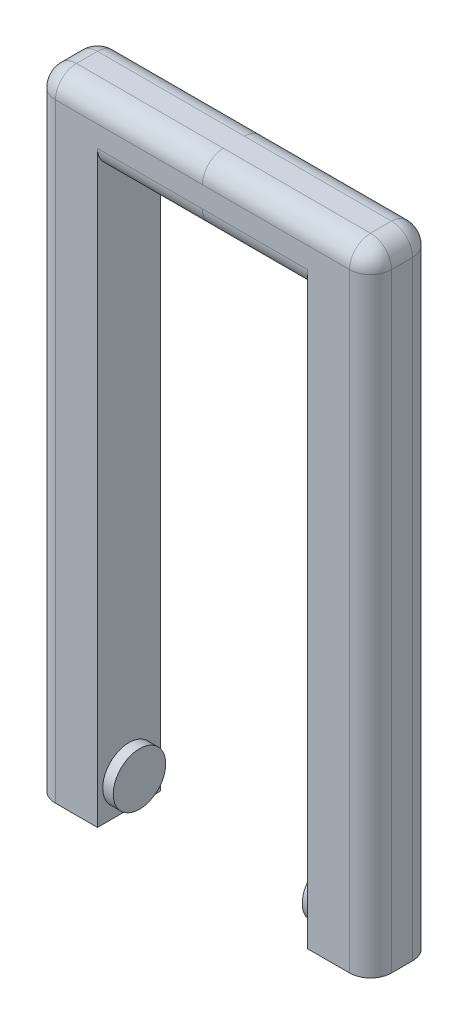
ISO-10303-21;
HEADER;
FILE_DESCRIPTION(('STEP AP214'),'2;1');
FILE_NAME('part.step','',(''),(''),'','','');
FILE_SCHEMA(('AUTOMOTIVE_DESIGN { 1 0 10303 214 1 1 1 1 }'));
ENDSEC;
DATA;
#1=APPLICATION_CONTEXT('core data for automotive mechanical design processes');
#2=APPLICATION_PROTOCOL_DEFINITION('international standard','automotive_design',2000,#1);
#3=PRODUCT_CONTEXT('',#1,'mechanical');
#4=PRODUCT('Part','Part','',(#3));
#5=PRODUCT_RELATED_PRODUCT_CATEGORY('part','',(#4));
#6=PRODUCT_DEFINITION_FORMATION('','',#4);
#7=PRODUCT_DEFINITION_CONTEXT('part definition',#1,'design');
#8=PRODUCT_DEFINITION('design','',#6,#7);
#9=PRODUCT_DEFINITION_SHAPE('','',#8);
#10=(LENGTH_UNIT() NAMED_UNIT(*) SI_UNIT(.MILLI.,.METRE.));
#11=(NAMED_UNIT(*) PLANE_ANGLE_UNIT() SI_UNIT($,.RADIAN.));
#12=(NAMED_UNIT(*) SI_UNIT($,.STERADIAN.) SOLID_ANGLE_UNIT());
#13=UNCERTAINTY_MEASURE_WITH_UNIT(LENGTH_MEASURE(1.E-05),#10,'distance_accuracy_value','');
#14=(GEOMETRIC_REPRESENTATION_CONTEXT(3) GLOBAL_UNCERTAINTY_ASSIGNED_CONTEXT((#13)) GLOBAL_UNIT_ASSIGNED_CONTEXT((#10,
#11,#12)) REPRESENTATION_CONTEXT('',''));
#15=CARTESIAN_POINT('',(0.,0.,0.));
#16=DIRECTION('',(0.,0.,1.));
#17=DIRECTION('',(1.,0.,0.));
#18=AXIS2_PLACEMENT_3D('',#15,#16,#17);
#19=CARTESIAN_POINT('',(0.,30.,3.));
#20=DIRECTION('',(0.,-1.,0.));
#21=DIRECTION('',(0.,0.,-1.));
#22=AXIS2_PLACEMENT_3D('',#19,#20,#21);
#23=PLANE('',#22);
#24=DIRECTION('',(-1.,0.,0.));
#25=VECTOR('',#24,1.);
#26=CARTESIAN_POINT('',(0.,30.,2.));
#27=LINE('',#26,#25);
#28=CARTESIAN_POINT('',(-6.99999999999999,30.,2.));
#29=VERTEX_POINT('',#28);
#30=CARTESIAN_POINT('',(0.,30.,2.));
#31=VERTEX_POINT('',#30);
#32=EDGE_CURVE('E264',#29,#31,#27,.F.);
#33=ORIENTED_EDGE('',*,*,#32,.T.);
#34=DIRECTION('',(1.,0.,0.));
#35=VECTOR('',#34,1.);
#36=CARTESIAN_POINT('',(6.99999999999999,30.,2.));
#37=LINE('',#36,#35);
#38=CARTESIAN_POINT('',(6.99999999999999,30.,2.));
#39=VERTEX_POINT('',#38);
#40=EDGE_CURVE('E327',#31,#39,#37,.T.);
#41=ORIENTED_EDGE('',*,*,#40,.T.);
#42=DIRECTION('',(0.,0.,-1.));
#43=VECTOR('',#42,1.);
#44=CARTESIAN_POINT('',(6.99999999999999,30.,1.));
#45=LINE('',#44,#43);
#46=CARTESIAN_POINT('',(6.99999999999999,30.,1.));
#47=VERTEX_POINT('',#46);
#48=EDGE_CURVE('E325',#39,#47,#45,.T.);
#49=ORIENTED_EDGE('',*,*,#48,.T.);
#50=DIRECTION('',(1.,0.,0.));
#51=VECTOR('',#50,1.);
#52=CARTESIAN_POINT('',(0.,30.,1.));
#53=LINE('',#52,#51);
#54=CARTESIAN_POINT('',(0.,30.,1.));
#55=VERTEX_POINT('',#54);
#56=EDGE_CURVE('E323',#47,#55,#53,.F.);
#57=ORIENTED_EDGE('',*,*,#56,.T.);
#58=DIRECTION('',(-1.,0.,0.));
#59=VECTOR('',#58,1.);
#60=CARTESIAN_POINT('',(0.,30.,1.));
#61=LINE('',#60,#59);
#62=CARTESIAN_POINT('',(-6.99999999999999,30.,1.));
#63=VERTEX_POINT('',#62);
#64=EDGE_CURVE('E260',#55,#63,#61,.T.);
#65=ORIENTED_EDGE('',*,*,#64,.T.);
#66=DIRECTION('',(0.,0.,-1.));
#67=VECTOR('',#66,1.);
#68=CARTESIAN_POINT('',(-6.99999999999999,30.,3.));
#69=LINE('',#68,#67);
#70=EDGE_CURVE('E262',#63,#29,#69,.F.);
#71=ORIENTED_EDGE('',*,*,#70,.T.);
#72=EDGE_LOOP('',(#33,#41,#49,#57,#65,#71));
#73=FACE_BOUND('',#72,.T.);
#74=ADVANCED_FACE('F42',(#73),#23,.F.);
#75=CARTESIAN_POINT('',(-7.99999999999999,18.,3.));
#76=DIRECTION('',(1.,0.,0.));
#77=DIRECTION('',(0.,1.,0.));
#78=AXIS2_PLACEMENT_3D('',#75,#76,#77);
#79=PLANE('',#78);
#80=DIRECTION('',(0.,-1.,0.));
#81=VECTOR('',#80,1.);
#82=CARTESIAN_POINT('',(-7.99999999999999,30.,2.));
#83=LINE('',#82,#81);
#84=CARTESIAN_POINT('',(-8.,0.,2.));
#85=VERTEX_POINT('',#84);
#86=CARTESIAN_POINT('',(-7.99999999999999,29.,2.));
#87=VERTEX_POINT('',#86);
#88=EDGE_CURVE('E241',#85,#87,#83,.F.);
#89=ORIENTED_EDGE('',*,*,#88,.T.);
#90=DIRECTION('',(0.,0.,-1.));
#91=VECTOR('',#90,1.);
#92=CARTESIAN_POINT('',(-7.99999999999999,29.,3.));
#93=LINE('',#92,#91);
#94=CARTESIAN_POINT('',(-7.99999999999999,29.,1.));
#95=VERTEX_POINT('',#94);
#96=EDGE_CURVE('E258',#87,#95,#93,.T.);
#97=ORIENTED_EDGE('',*,*,#96,.T.);
#98=DIRECTION('',(0.,-1.,0.));
#99=VECTOR('',#98,1.);
#100=CARTESIAN_POINT('',(-7.99999999999999,18.,1.));
#101=LINE('',#100,#99);
#102=CARTESIAN_POINT('',(-8.,0.,1.));
#103=VERTEX_POINT('',#102);
#104=EDGE_CURVE('E244',#95,#103,#101,.T.);
#105=ORIENTED_EDGE('',*,*,#104,.T.);
#106=DIRECTION('',(0.,0.,-1.));
#107=VECTOR('',#106,1.);
#108=CARTESIAN_POINT('',(-8.,0.,3.));
#109=LINE('',#108,#107);
#110=EDGE_CURVE('E235',#85,#103,#109,.T.);
#111=ORIENTED_EDGE('',*,*,#110,.F.);
#112=EDGE_LOOP('',(#89,#97,#105,#111));
#113=FACE_BOUND('',#112,.T.);
#114=ADVANCED_FACE('F380',(#113),#79,.F.);
#115=CARTESIAN_POINT('',(-8.,0.,3.));
#116=DIRECTION('',(0.,1.,0.));
#117=DIRECTION('',(0.,0.,1.));
#118=AXIS2_PLACEMENT_3D('',#115,#116,#117);
#119=PLANE('',#118);
#120=ORIENTED_EDGE('',*,*,#110,.T.);
#121=CARTESIAN_POINT('',(-7.,0.,1.));
#122=DIRECTION('',(0.,1.,0.));
#123=DIRECTION('',(0.,0.,1.));
#124=AXIS2_PLACEMENT_3D('',#121,#122,#123);
#125=CIRCLE('',#124,1.);
#126=CARTESIAN_POINT('',(-7.,0.,0.));
#127=VERTEX_POINT('',#126);
#128=EDGE_CURVE('E248',#103,#127,#125,.F.);
#129=ORIENTED_EDGE('',*,*,#128,.T.);
#130=DIRECTION('',(1.,0.,0.));
#131=VECTOR('',#130,1.);
#132=CARTESIAN_POINT('',(-8.,0.,0.));
#133=LINE('',#132,#131);
#134=CARTESIAN_POINT('',(-5.,0.,0.));
#135=VERTEX_POINT('',#134);
#136=EDGE_CURVE('E220',#127,#135,#133,.T.);
#137=ORIENTED_EDGE('',*,*,#136,.T.);
#138=DIRECTION('',(0.,0.,-1.));
#139=VECTOR('',#138,1.);
#140=CARTESIAN_POINT('',(-5.,0.,3.));
#141=LINE('',#140,#139);
#142=CARTESIAN_POINT('',(-5.,0.,3.));
#143=VERTEX_POINT('',#142);
#144=EDGE_CURVE('E232',#143,#135,#141,.T.);
#145=ORIENTED_EDGE('',*,*,#144,.F.);
#146=DIRECTION('',(1.,0.,0.));
#147=VECTOR('',#146,1.);
#148=CARTESIAN_POINT('',(-8.,0.,3.));
#149=LINE('',#148,#147);
#150=CARTESIAN_POINT('',(-7.,0.,3.));
#151=VERTEX_POINT('',#150);
#152=EDGE_CURVE('E222',#151,#143,#149,.T.);
#153=ORIENTED_EDGE('',*,*,#152,.F.);
#154=CARTESIAN_POINT('',(-7.,0.,2.));
#155=DIRECTION('',(0.,1.,0.));
#156=DIRECTION('',(0.,0.,1.));
#157=AXIS2_PLACEMENT_3D('',#154,#155,#156);
#158=CIRCLE('',#157,1.);
#159=EDGE_CURVE('E246',#151,#85,#158,.F.);
#160=ORIENTED_EDGE('',*,*,#159,.T.);
#161=EDGE_LOOP('',(#120,#129,#137,#145,#153,#160));
#162=FACE_BOUND('',#161,.T.);
#163=ADVANCED_FACE('F386',(#162),#119,.F.);
#164=CARTESIAN_POINT('',(-5.,0.,3.));
#165=DIRECTION('',(-1.,0.,0.));
#166=DIRECTION('',(0.,-1.,0.));
#167=AXIS2_PLACEMENT_3D('',#164,#165,#166);
#168=PLANE('',#167);
#169=CARTESIAN_POINT('',(-5.,1.5,1.5));
#170=DIRECTION('',(-1.,0.,0.));
#171=DIRECTION('',(0.,-1.,0.));
#172=AXIS2_PLACEMENT_3D('',#169,#170,#171);
#173=CIRCLE('',#172,1.25);
#174=CARTESIAN_POINT('',(-5.,0.25,1.5));
#175=VERTEX_POINT('',#174);
#176=EDGE_CURVE('E238',#175,#175,#173,.F.);
#177=ORIENTED_EDGE('',*,*,#176,.F.);
#178=EDGE_LOOP('',(#177));
#179=FACE_BOUND('',#178,.T.);
#180=DIRECTION('',(0.,1.,0.));
#181=VECTOR('',#180,1.);
#182=CARTESIAN_POINT('',(-5.,0.,0.));
#183=LINE('',#182,#181);
#184=CARTESIAN_POINT('',(-5.,28.,0.));
#185=VERTEX_POINT('',#184);
#186=EDGE_CURVE('E225',#135,#185,#183,.T.);
#187=ORIENTED_EDGE('',*,*,#186,.T.);
#188=CARTESIAN_POINT('',(-5.,28.,1.));
#189=DIRECTION('',(-1.,0.,0.));
#190=DIRECTION('',(0.,-1.,0.));
#191=AXIS2_PLACEMENT_3D('',#188,#189,#190);
#192=CIRCLE('',#191,1.);
#193=CARTESIAN_POINT('',(-5.,27.,1.));
#194=VERTEX_POINT('',#193);
#195=EDGE_CURVE('E291',#185,#194,#192,.T.);
#196=ORIENTED_EDGE('',*,*,#195,.T.);
#197=DIRECTION('',(0.,0.,-1.));
#198=VECTOR('',#197,1.);
#199=CARTESIAN_POINT('',(-5.,27.,3.));
#200=LINE('',#199,#198);
#201=CARTESIAN_POINT('',(-5.,27.,2.));
#202=VERTEX_POINT('',#201);
#203=EDGE_CURVE('E227',#202,#194,#200,.T.);
#204=ORIENTED_EDGE('',*,*,#203,.F.);
#205=CARTESIAN_POINT('',(-5.,28.,2.));
#206=DIRECTION('',(-1.,0.,0.));
#207=DIRECTION('',(0.,-1.,0.));
#208=AXIS2_PLACEMENT_3D('',#205,#206,#207);
#209=CIRCLE('',#208,1.);
#210=CARTESIAN_POINT('',(-5.,28.,3.));
#211=VERTEX_POINT('',#210);
#212=EDGE_CURVE('E293',#202,#211,#209,.T.);
#213=ORIENTED_EDGE('',*,*,#212,.T.);
#214=DIRECTION('',(0.,1.,0.));
#215=VECTOR('',#214,1.);
#216=CARTESIAN_POINT('',(-5.,0.,3.));
#217=LINE('',#216,#215);
#218=EDGE_CURVE('E224',#143,#211,#217,.T.);
#219=ORIENTED_EDGE('',*,*,#218,.F.);
#220=ORIENTED_EDGE('',*,*,#144,.T.);
#221=EDGE_LOOP('',(#187,#196,#204,#213,#219,#220));
#222=FACE_BOUND('',#221,.T.);
#223=ADVANCED_FACE('F467',(#179,#222),#168,.F.);
#224=CARTESIAN_POINT('',(-5.,27.,3.));
#225=DIRECTION('',(0.,1.,0.));
#226=DIRECTION('',(0.,0.,1.));
#227=AXIS2_PLACEMENT_3D('',#224,#225,#226);
#228=PLANE('',#227);
#229=DIRECTION('',(1.,0.,0.));
#230=VECTOR('',#229,1.);
#231=CARTESIAN_POINT('',(-5.,27.,1.));
#232=LINE('',#231,#230);
#233=CARTESIAN_POINT('',(0.,27.,1.));
#234=VERTEX_POINT('',#233);
#235=EDGE_CURVE('E270',#194,#234,#232,.T.);
#236=ORIENTED_EDGE('',*,*,#235,.T.);
#237=DIRECTION('',(-1.,0.,0.));
#238=VECTOR('',#237,1.);
#239=CARTESIAN_POINT('',(-5.,27.,1.));
#240=LINE('',#239,#238);
#241=CARTESIAN_POINT('',(5.,27.,1.));
#242=VERTEX_POINT('',#241);
#243=EDGE_CURVE('E66',#234,#242,#240,.F.);
#244=ORIENTED_EDGE('',*,*,#243,.T.);
#245=DIRECTION('',(0.,0.,-1.));
#246=VECTOR('',#245,1.);
#247=CARTESIAN_POINT('',(5.,27.,3.));
#248=LINE('',#247,#246);
#249=CARTESIAN_POINT('',(5.,27.,2.));
#250=VERTEX_POINT('',#249);
#251=EDGE_CURVE('E199',#250,#242,#248,.T.);
#252=ORIENTED_EDGE('',*,*,#251,.F.);
#253=DIRECTION('',(-1.,0.,0.));
#254=VECTOR('',#253,1.);
#255=CARTESIAN_POINT('',(0.,27.,2.));
#256=LINE('',#255,#254);
#257=CARTESIAN_POINT('',(0.,27.,2.));
#258=VERTEX_POINT('',#257);
#259=EDGE_CURVE('E338',#250,#258,#256,.T.);
#260=ORIENTED_EDGE('',*,*,#259,.T.);
#261=DIRECTION('',(1.,0.,0.));
#262=VECTOR('',#261,1.);
#263=CARTESIAN_POINT('',(-5.,27.,2.));
#264=LINE('',#263,#262);
#265=EDGE_CURVE('E268',#258,#202,#264,.F.);
#266=ORIENTED_EDGE('',*,*,#265,.T.);
#267=ORIENTED_EDGE('',*,*,#203,.T.);
#268=EDGE_LOOP('',(#236,#244,#252,#260,#266,#267));
#269=FACE_BOUND('',#268,.T.);
#270=ADVANCED_FACE('F458',(#269),#228,.F.);
#271=CARTESIAN_POINT('',(0.,0.,3.));
#272=DIRECTION('',(0.,0.,1.));
#273=DIRECTION('',(1.,0.,0.));
#274=AXIS2_PLACEMENT_3D('',#271,#272,#273);
#275=PLANE('',#274);
#276=DIRECTION('',(1.,0.,0.));
#277=VECTOR('',#276,1.);
#278=CARTESIAN_POINT('',(0.,28.,3.));
#279=LINE('',#278,#277);
#280=CARTESIAN_POINT('',(0.,28.,3.));
#281=VERTEX_POINT('',#280);
#282=EDGE_CURVE('E289',#211,#281,#279,.T.);
#283=ORIENTED_EDGE('',*,*,#282,.T.);
#284=DIRECTION('',(-1.,0.,0.));
#285=VECTOR('',#284,1.);
#286=CARTESIAN_POINT('',(5.,28.,3.));
#287=LINE('',#286,#285);
#288=CARTESIAN_POINT('',(5.,28.,3.));
#289=VERTEX_POINT('',#288);
#290=EDGE_CURVE('E204',#281,#289,#287,.F.);
#291=ORIENTED_EDGE('',*,*,#290,.T.);
#292=DIRECTION('',(0.,1.,0.));
#293=VECTOR('',#292,1.);
#294=CARTESIAN_POINT('',(5.,0.,3.));
#295=LINE('',#294,#293);
#296=CARTESIAN_POINT('',(5.,0.,3.));
#297=VERTEX_POINT('',#296);
#298=EDGE_CURVE('E58',#297,#289,#295,.T.);
#299=ORIENTED_EDGE('',*,*,#298,.F.);
#300=DIRECTION('',(-1.,0.,0.));
#301=VECTOR('',#300,1.);
#302=CARTESIAN_POINT('',(8.,0.,3.));
#303=LINE('',#302,#301);
#304=CARTESIAN_POINT('',(7.,0.,3.));
#305=VERTEX_POINT('',#304);
#306=EDGE_CURVE('E183',#305,#297,#303,.T.);
#307=ORIENTED_EDGE('',*,*,#306,.F.);
#308=DIRECTION('',(0.,-1.,0.));
#309=VECTOR('',#308,1.);
#310=CARTESIAN_POINT('',(7.,0.,3.));
#311=LINE('',#310,#309);
#312=CARTESIAN_POINT('',(6.99999999999999,29.,3.));
#313=VERTEX_POINT('',#312);
#314=EDGE_CURVE('E318',#305,#313,#311,.F.);
#315=ORIENTED_EDGE('',*,*,#314,.T.);
#316=DIRECTION('',(1.,0.,0.));
#317=VECTOR('',#316,1.);
#318=CARTESIAN_POINT('',(0.,29.,3.));
#319=LINE('',#318,#317);
#320=CARTESIAN_POINT('',(0.,29.,3.));
#321=VERTEX_POINT('',#320);
#322=EDGE_CURVE('E342',#313,#321,#319,.F.);
#323=ORIENTED_EDGE('',*,*,#322,.T.);
#324=DIRECTION('',(-1.,0.,0.));
#325=VECTOR('',#324,1.);
#326=CARTESIAN_POINT('',(-6.99999999999999,29.,3.));
#327=LINE('',#326,#325);
#328=CARTESIAN_POINT('',(-6.99999999999999,29.,3.));
#329=VERTEX_POINT('',#328);
#330=EDGE_CURVE('E287',#321,#329,#327,.T.);
#331=ORIENTED_EDGE('',*,*,#330,.T.);
#332=DIRECTION('',(0.,-1.,0.));
#333=VECTOR('',#332,1.);
#334=CARTESIAN_POINT('',(-7.,0.,3.));
#335=LINE('',#334,#333);
#336=EDGE_CURVE('E253',#329,#151,#335,.T.);
#337=ORIENTED_EDGE('',*,*,#336,.T.);
#338=ORIENTED_EDGE('',*,*,#152,.T.);
#339=ORIENTED_EDGE('',*,*,#218,.T.);
#340=EDGE_LOOP('',(#283,#291,#299,#307,#315,#323,#331,#337,#338,#339));
#341=FACE_BOUND('',#340,.T.);
#342=ADVANCED_FACE('F202',(#341),#275,.T.);
#343=CARTESIAN_POINT('',(0.,0.,0.));
#344=DIRECTION('',(0.,0.,1.));
#345=DIRECTION('',(1.,0.,0.));
#346=AXIS2_PLACEMENT_3D('',#343,#344,#345);
#347=PLANE('',#346);
#348=DIRECTION('',(0.,1.,0.));
#349=VECTOR('',#348,1.);
#350=CARTESIAN_POINT('',(5.,0.,0.));
#351=LINE('',#350,#349);
#352=CARTESIAN_POINT('',(5.,0.,0.));
#353=VERTEX_POINT('',#352);
#354=CARTESIAN_POINT('',(5.,28.,0.));
#355=VERTEX_POINT('',#354);
#356=EDGE_CURVE('E198',#353,#355,#351,.T.);
#357=ORIENTED_EDGE('',*,*,#356,.T.);
#358=DIRECTION('',(-1.,0.,0.));
#359=VECTOR('',#358,1.);
#360=CARTESIAN_POINT('',(0.,28.,0.));
#361=LINE('',#360,#359);
#362=CARTESIAN_POINT('',(0.,28.,0.));
#363=VERTEX_POINT('',#362);
#364=EDGE_CURVE('E335',#355,#363,#361,.T.);
#365=ORIENTED_EDGE('',*,*,#364,.T.);
#366=DIRECTION('',(1.,0.,0.));
#367=VECTOR('',#366,1.);
#368=CARTESIAN_POINT('',(0.,28.,0.));
#369=LINE('',#368,#367);
#370=EDGE_CURVE('E284',#363,#185,#369,.F.);
#371=ORIENTED_EDGE('',*,*,#370,.T.);
#372=ORIENTED_EDGE('',*,*,#186,.F.);
#373=ORIENTED_EDGE('',*,*,#136,.F.);
#374=DIRECTION('',(0.,-1.,0.));
#375=VECTOR('',#374,1.);
#376=CARTESIAN_POINT('',(-7.,0.,0.));
#377=LINE('',#376,#375);
#378=CARTESIAN_POINT('',(-6.99999999999999,29.,0.));
#379=VERTEX_POINT('',#378);
#380=EDGE_CURVE('E250',#127,#379,#377,.F.);
#381=ORIENTED_EDGE('',*,*,#380,.T.);
#382=DIRECTION('',(-1.,0.,0.));
#383=VECTOR('',#382,1.);
#384=CARTESIAN_POINT('',(0.,29.,0.));
#385=LINE('',#384,#383);
#386=CARTESIAN_POINT('',(0.,29.,0.));
#387=VERTEX_POINT('',#386);
#388=EDGE_CURVE('E282',#379,#387,#385,.F.);
#389=ORIENTED_EDGE('',*,*,#388,.T.);
#390=DIRECTION('',(1.,0.,0.));
#391=VECTOR('',#390,1.);
#392=CARTESIAN_POINT('',(0.,29.,0.));
#393=LINE('',#392,#391);
#394=CARTESIAN_POINT('',(6.99999999999999,29.,0.));
#395=VERTEX_POINT('',#394);
#396=EDGE_CURVE('E333',#387,#395,#393,.T.);
#397=ORIENTED_EDGE('',*,*,#396,.T.);
#398=DIRECTION('',(0.,-1.,0.));
#399=VECTOR('',#398,1.);
#400=CARTESIAN_POINT('',(7.,0.,0.));
#401=LINE('',#400,#399);
#402=CARTESIAN_POINT('',(7.,0.,0.));
#403=VERTEX_POINT('',#402);
#404=EDGE_CURVE('E308',#395,#403,#401,.T.);
#405=ORIENTED_EDGE('',*,*,#404,.T.);
#406=DIRECTION('',(-1.,0.,0.));
#407=VECTOR('',#406,1.);
#408=CARTESIAN_POINT('',(8.,0.,0.));
#409=LINE('',#408,#407);
#410=EDGE_CURVE('E206',#403,#353,#409,.T.);
#411=ORIENTED_EDGE('',*,*,#410,.T.);
#412=EDGE_LOOP('',(#357,#365,#371,#372,#373,#381,#389,#397,#405,#411));
#413=FACE_BOUND('',#412,.T.);
#414=ADVANCED_FACE('F472',(#413),#347,.F.);
#415=CARTESIAN_POINT('',(-4.5,1.5,1.5));
#416=DIRECTION('',(-1.,0.,0.));
#417=DIRECTION('',(0.,-1.,0.));
#418=AXIS2_PLACEMENT_3D('',#415,#416,#417);
#419=CYLINDRICAL_SURFACE('',#418,1.25);
#420=CARTESIAN_POINT('',(-4.5,1.5,1.5));
#421=DIRECTION('',(1.,0.,0.));
#422=DIRECTION('',(0.,1.,0.));
#423=AXIS2_PLACEMENT_3D('',#420,#421,#422);
#424=CIRCLE('',#423,1.25);
#425=CARTESIAN_POINT('',(-4.5,2.75,1.5));
#426=VERTEX_POINT('',#425);
#427=EDGE_CURVE('E217',#426,#426,#424,.T.);
#428=ORIENTED_EDGE('',*,*,#427,.F.);
#429=EDGE_LOOP('',(#428));
#430=FACE_BOUND('',#429,.T.);
#431=ORIENTED_EDGE('',*,*,#176,.T.);
#432=EDGE_LOOP('',(#431));
#433=FACE_BOUND('',#432,.T.);
#434=ADVANCED_FACE('F520',(#430,#433),#419,.T.);
#435=CARTESIAN_POINT('',(-4.5,1.5,1.5));
#436=DIRECTION('',(1.,0.,0.));
#437=DIRECTION('',(0.,1.,0.));
#438=AXIS2_PLACEMENT_3D('',#435,#436,#437);
#439=PLANE('',#438);
#440=ORIENTED_EDGE('',*,*,#427,.T.);
#441=EDGE_LOOP('',(#440));
#442=FACE_BOUND('',#441,.T.);
#443=ADVANCED_FACE('F395',(#442),#439,.T.);
#444=CARTESIAN_POINT('',(-6.99999999999999,18.,1.));
#445=DIRECTION('',(0.,-1.,0.));
#446=DIRECTION('',(1.,0.,0.));
#447=AXIS2_PLACEMENT_3D('',#444,#445,#446);
#448=CYLINDRICAL_SURFACE('',#447,1.);
#449=ORIENTED_EDGE('',*,*,#104,.F.);
#450=CARTESIAN_POINT('',(-6.99999999999999,29.,1.));
#451=DIRECTION('',(0.,-1.,0.));
#452=DIRECTION('',(1.,0.,0.));
#453=AXIS2_PLACEMENT_3D('',#450,#451,#452);
#454=CIRCLE('',#453,1.);
#455=EDGE_CURVE('E266',#95,#379,#454,.T.);
#456=ORIENTED_EDGE('',*,*,#455,.T.);
#457=ORIENTED_EDGE('',*,*,#380,.F.);
#458=ORIENTED_EDGE('',*,*,#128,.F.);
#459=EDGE_LOOP('',(#449,#456,#457,#458));
#460=FACE_BOUND('',#459,.T.);
#461=ADVANCED_FACE('F391',(#460),#448,.T.);
#462=CARTESIAN_POINT('',(-7.,0.,2.));
#463=DIRECTION('',(0.,1.,0.));
#464=DIRECTION('',(-1.,0.,0.));
#465=AXIS2_PLACEMENT_3D('',#462,#463,#464);
#466=CYLINDRICAL_SURFACE('',#465,1.);
#467=ORIENTED_EDGE('',*,*,#336,.F.);
#468=CARTESIAN_POINT('',(-6.99999999999999,29.,2.));
#469=DIRECTION('',(0.,1.,0.));
#470=DIRECTION('',(-1.,0.,0.));
#471=AXIS2_PLACEMENT_3D('',#468,#469,#470);
#472=CIRCLE('',#471,1.);
#473=EDGE_CURVE('E255',#329,#87,#472,.F.);
#474=ORIENTED_EDGE('',*,*,#473,.T.);
#475=ORIENTED_EDGE('',*,*,#88,.F.);
#476=ORIENTED_EDGE('',*,*,#159,.F.);
#477=EDGE_LOOP('',(#467,#474,#475,#476));
#478=FACE_BOUND('',#477,.T.);
#479=ADVANCED_FACE('F394',(#478),#466,.T.);
#480=CARTESIAN_POINT('',(0.,29.,1.));
#481=DIRECTION('',(-1.,0.,0.));
#482=DIRECTION('',(0.,0.,1.));
#483=AXIS2_PLACEMENT_3D('',#480,#481,#482);
#484=CYLINDRICAL_SURFACE('',#483,1.);
#485=CARTESIAN_POINT('',(0.,29.,1.));
#486=DIRECTION('',(-1.,0.,0.));
#487=DIRECTION('',(0.,-1.,0.));
#488=AXIS2_PLACEMENT_3D('',#485,#486,#487);
#489=CIRCLE('',#488,1.);
#490=EDGE_CURVE('E272',#387,#55,#489,.F.);
#491=ORIENTED_EDGE('',*,*,#490,.F.);
#492=ORIENTED_EDGE('',*,*,#388,.F.);
#493=CARTESIAN_POINT('',(-6.99999999999999,29.,1.));
#494=DIRECTION('',(-1.,0.,0.));
#495=DIRECTION('',(0.,0.,1.));
#496=AXIS2_PLACEMENT_3D('',#493,#494,#495);
#497=CIRCLE('',#496,1.);
#498=EDGE_CURVE('E221',#63,#379,#497,.T.);
#499=ORIENTED_EDGE('',*,*,#498,.F.);
#500=ORIENTED_EDGE('',*,*,#64,.F.);
#501=EDGE_LOOP('',(#491,#492,#499,#500));
#502=FACE_BOUND('',#501,.T.);
#503=ADVANCED_FACE('F399',(#502),#484,.T.);
#504=CARTESIAN_POINT('',(-6.99999999999999,29.,1.));
#505=DIRECTION('',(0.,-1.,0.));
#506=DIRECTION('',(0.,0.,-1.));
#507=AXIS2_PLACEMENT_3D('',#504,#505,#506);
#508=SPHERICAL_SURFACE('',#507,1.);
#509=ORIENTED_EDGE('',*,*,#498,.T.);
#510=ORIENTED_EDGE('',*,*,#455,.F.);
#511=CARTESIAN_POINT('',(-6.99999999999999,29.,1.));
#512=DIRECTION('',(0.,0.,1.));
#513=DIRECTION('',(1.,0.,0.));
#514=AXIS2_PLACEMENT_3D('',#511,#512,#513);
#515=CIRCLE('',#514,1.);
#516=EDGE_CURVE('E301',#63,#95,#515,.T.);
#517=ORIENTED_EDGE('',*,*,#516,.F.);
#518=EDGE_LOOP('',(#509,#510,#517));
#519=FACE_BOUND('',#518,.T.);
#520=ADVANCED_FACE('F413',(#519),#508,.T.);
#521=CARTESIAN_POINT('',(-6.99999999999999,29.,3.));
#522=DIRECTION('',(0.,0.,-1.));
#523=DIRECTION('',(-1.,0.,0.));
#524=AXIS2_PLACEMENT_3D('',#521,#522,#523);
#525=CYLINDRICAL_SURFACE('',#524,1.);
#526=ORIENTED_EDGE('',*,*,#516,.T.);
#527=ORIENTED_EDGE('',*,*,#96,.F.);
#528=CARTESIAN_POINT('',(-6.99999999999999,29.,2.));
#529=DIRECTION('',(0.,0.,1.));
#530=DIRECTION('',(1.,0.,0.));
#531=AXIS2_PLACEMENT_3D('',#528,#529,#530);
#532=CIRCLE('',#531,1.);
#533=EDGE_CURVE('E299',#29,#87,#532,.T.);
#534=ORIENTED_EDGE('',*,*,#533,.F.);
#535=ORIENTED_EDGE('',*,*,#70,.F.);
#536=EDGE_LOOP('',(#526,#527,#534,#535));
#537=FACE_BOUND('',#536,.T.);
#538=ADVANCED_FACE('F409',(#537),#525,.T.);
#539=CARTESIAN_POINT('',(0.,29.,2.));
#540=DIRECTION('',(1.,0.,0.));
#541=DIRECTION('',(0.,0.,-1.));
#542=AXIS2_PLACEMENT_3D('',#539,#540,#541);
#543=CYLINDRICAL_SURFACE('',#542,1.);
#544=CARTESIAN_POINT('',(0.,29.,2.));
#545=DIRECTION('',(-1.,0.,0.));
#546=DIRECTION('',(0.,-1.,0.));
#547=AXIS2_PLACEMENT_3D('',#544,#545,#546);
#548=CIRCLE('',#547,1.);
#549=EDGE_CURVE('E275',#31,#321,#548,.F.);
#550=ORIENTED_EDGE('',*,*,#549,.F.);
#551=ORIENTED_EDGE('',*,*,#32,.F.);
#552=CARTESIAN_POINT('',(-6.99999999999999,29.,2.));
#553=DIRECTION('',(-1.,0.,0.));
#554=DIRECTION('',(0.,0.,1.));
#555=AXIS2_PLACEMENT_3D('',#552,#553,#554);
#556=CIRCLE('',#555,1.);
#557=EDGE_CURVE('E216',#329,#29,#556,.T.);
#558=ORIENTED_EDGE('',*,*,#557,.F.);
#559=ORIENTED_EDGE('',*,*,#330,.F.);
#560=EDGE_LOOP('',(#550,#551,#558,#559));
#561=FACE_BOUND('',#560,.T.);
#562=ADVANCED_FACE('F405',(#561),#543,.T.);
#563=CARTESIAN_POINT('',(-6.99999999999999,29.,2.));
#564=DIRECTION('',(0.,-1.,0.));
#565=DIRECTION('',(0.,0.,-1.));
#566=AXIS2_PLACEMENT_3D('',#563,#564,#565);
#567=SPHERICAL_SURFACE('',#566,1.);
#568=ORIENTED_EDGE('',*,*,#533,.T.);
#569=ORIENTED_EDGE('',*,*,#473,.F.);
#570=ORIENTED_EDGE('',*,*,#557,.T.);
#571=EDGE_LOOP('',(#568,#569,#570));
#572=FACE_BOUND('',#571,.T.);
#573=ADVANCED_FACE('F401',(#572),#567,.T.);
#574=CARTESIAN_POINT('',(-5.,28.,1.));
#575=DIRECTION('',(1.,0.,0.));
#576=DIRECTION('',(0.,0.,-1.));
#577=AXIS2_PLACEMENT_3D('',#574,#575,#576);
#578=CYLINDRICAL_SURFACE('',#577,1.);
#579=ORIENTED_EDGE('',*,*,#195,.F.);
#580=ORIENTED_EDGE('',*,*,#370,.F.);
#581=CARTESIAN_POINT('',(0.,28.,1.));
#582=DIRECTION('',(-1.,0.,0.));
#583=DIRECTION('',(0.,-1.,0.));
#584=AXIS2_PLACEMENT_3D('',#581,#582,#583);
#585=CIRCLE('',#584,1.);
#586=EDGE_CURVE('E280',#234,#363,#585,.F.);
#587=ORIENTED_EDGE('',*,*,#586,.F.);
#588=ORIENTED_EDGE('',*,*,#235,.F.);
#589=EDGE_LOOP('',(#579,#580,#587,#588));
#590=FACE_BOUND('',#589,.T.);
#591=ADVANCED_FACE('F404',(#590),#578,.T.);
#592=CARTESIAN_POINT('',(0.,28.,2.));
#593=DIRECTION('',(-1.,0.,0.));
#594=DIRECTION('',(0.,0.,1.));
#595=AXIS2_PLACEMENT_3D('',#592,#593,#594);
#596=CYLINDRICAL_SURFACE('',#595,1.);
#597=ORIENTED_EDGE('',*,*,#212,.F.);
#598=ORIENTED_EDGE('',*,*,#265,.F.);
#599=CARTESIAN_POINT('',(0.,28.,2.));
#600=DIRECTION('',(-1.,0.,0.));
#601=DIRECTION('',(0.,-1.,0.));
#602=AXIS2_PLACEMENT_3D('',#599,#600,#601);
#603=CIRCLE('',#602,1.);
#604=EDGE_CURVE('E278',#281,#258,#603,.F.);
#605=ORIENTED_EDGE('',*,*,#604,.F.);
#606=ORIENTED_EDGE('',*,*,#282,.F.);
#607=EDGE_LOOP('',(#597,#598,#605,#606));
#608=FACE_BOUND('',#607,.T.);
#609=ADVANCED_FACE('F423',(#608),#596,.T.);
#610=CARTESIAN_POINT('',(5.,0.,3.));
#611=DIRECTION('',(-1.,0.,0.));
#612=DIRECTION('',(0.,-1.,0.));
#613=AXIS2_PLACEMENT_3D('',#610,#611,#612);
#614=PLANE('',#613);
#615=CARTESIAN_POINT('',(5.,1.5,1.5));
#616=DIRECTION('',(-1.,0.,0.));
#617=DIRECTION('',(0.,-1.,0.));
#618=AXIS2_PLACEMENT_3D('',#615,#616,#617);
#619=CIRCLE('',#618,1.25);
#620=CARTESIAN_POINT('',(5.,0.25,1.5));
#621=VERTEX_POINT('',#620);
#622=EDGE_CURVE('E296',#621,#621,#619,.T.);
#623=ORIENTED_EDGE('',*,*,#622,.F.);
#624=EDGE_LOOP('',(#623));
#625=FACE_BOUND('',#624,.T.);
#626=ORIENTED_EDGE('',*,*,#356,.F.);
#627=DIRECTION('',(0.,0.,-1.));
#628=VECTOR('',#627,1.);
#629=CARTESIAN_POINT('',(5.,0.,3.));
#630=LINE('',#629,#628);
#631=EDGE_CURVE('E186',#297,#353,#630,.T.);
#632=ORIENTED_EDGE('',*,*,#631,.F.);
#633=ORIENTED_EDGE('',*,*,#298,.T.);
#634=CARTESIAN_POINT('',(5.,28.,2.));
#635=DIRECTION('',(-1.,0.,0.));
#636=DIRECTION('',(0.,-1.,0.));
#637=AXIS2_PLACEMENT_3D('',#634,#635,#636);
#638=CIRCLE('',#637,1.);
#639=EDGE_CURVE('E11',#289,#250,#638,.F.);
#640=ORIENTED_EDGE('',*,*,#639,.T.);
#641=ORIENTED_EDGE('',*,*,#251,.T.);
#642=CARTESIAN_POINT('',(5.,28.,1.));
#643=DIRECTION('',(-1.,0.,0.));
#644=DIRECTION('',(0.,-1.,0.));
#645=AXIS2_PLACEMENT_3D('',#642,#643,#644);
#646=CIRCLE('',#645,1.);
#647=EDGE_CURVE('E51',#242,#355,#646,.F.);
#648=ORIENTED_EDGE('',*,*,#647,.T.);
#649=EDGE_LOOP('',(#626,#632,#633,#640,#641,#648));
#650=FACE_BOUND('',#649,.T.);
#651=ADVANCED_FACE('F196',(#625,#650),#614,.T.);
#652=CARTESIAN_POINT('',(8.,0.,3.));
#653=DIRECTION('',(0.,-1.,0.));
#654=DIRECTION('',(0.,0.,-1.));
#655=AXIS2_PLACEMENT_3D('',#652,#653,#654);
#656=PLANE('',#655);
#657=ORIENTED_EDGE('',*,*,#410,.F.);
#658=CARTESIAN_POINT('',(7.,0.,1.));
#659=DIRECTION('',(0.,-1.,0.));
#660=DIRECTION('',(0.,0.,-1.));
#661=AXIS2_PLACEMENT_3D('',#658,#659,#660);
#662=CIRCLE('',#661,1.);
#663=CARTESIAN_POINT('',(8.,0.,1.));
#664=VERTEX_POINT('',#663);
#665=EDGE_CURVE('E311',#403,#664,#662,.T.);
#666=ORIENTED_EDGE('',*,*,#665,.T.);
#667=DIRECTION('',(0.,0.,-1.));
#668=VECTOR('',#667,1.);
#669=CARTESIAN_POINT('',(8.,0.,3.));
#670=LINE('',#669,#668);
#671=CARTESIAN_POINT('',(8.,0.,2.));
#672=VERTEX_POINT('',#671);
#673=EDGE_CURVE('E194',#672,#664,#670,.T.);
#674=ORIENTED_EDGE('',*,*,#673,.F.);
#675=CARTESIAN_POINT('',(7.,0.,2.));
#676=DIRECTION('',(0.,-1.,0.));
#677=DIRECTION('',(0.,0.,-1.));
#678=AXIS2_PLACEMENT_3D('',#675,#676,#677);
#679=CIRCLE('',#678,1.);
#680=EDGE_CURVE('E190',#672,#305,#679,.T.);
#681=ORIENTED_EDGE('',*,*,#680,.T.);
#682=ORIENTED_EDGE('',*,*,#306,.T.);
#683=ORIENTED_EDGE('',*,*,#631,.T.);
#684=EDGE_LOOP('',(#657,#666,#674,#681,#682,#683));
#685=FACE_BOUND('',#684,.T.);
#686=ADVANCED_FACE('F185',(#685),#656,.T.);
#687=CARTESIAN_POINT('',(7.99999999999999,30.,3.));
#688=DIRECTION('',(1.,0.,0.));
#689=DIRECTION('',(0.,1.,0.));
#690=AXIS2_PLACEMENT_3D('',#687,#688,#689);
#691=PLANE('',#690);
#692=DIRECTION('',(0.,-1.,0.));
#693=VECTOR('',#692,1.);
#694=CARTESIAN_POINT('',(7.99999999999999,30.,1.));
#695=LINE('',#694,#693);
#696=CARTESIAN_POINT('',(7.99999999999999,29.,1.));
#697=VERTEX_POINT('',#696);
#698=EDGE_CURVE('E315',#664,#697,#695,.F.);
#699=ORIENTED_EDGE('',*,*,#698,.T.);
#700=DIRECTION('',(0.,0.,-1.));
#701=VECTOR('',#700,1.);
#702=CARTESIAN_POINT('',(7.99999999999999,29.,2.));
#703=LINE('',#702,#701);
#704=CARTESIAN_POINT('',(7.99999999999999,29.,2.));
#705=VERTEX_POINT('',#704);
#706=EDGE_CURVE('E329',#697,#705,#703,.F.);
#707=ORIENTED_EDGE('',*,*,#706,.T.);
#708=DIRECTION('',(0.,-1.,0.));
#709=VECTOR('',#708,1.);
#710=CARTESIAN_POINT('',(7.99999999999999,30.,2.));
#711=LINE('',#710,#709);
#712=EDGE_CURVE('E313',#705,#672,#711,.T.);
#713=ORIENTED_EDGE('',*,*,#712,.T.);
#714=ORIENTED_EDGE('',*,*,#673,.T.);
#715=EDGE_LOOP('',(#699,#707,#713,#714));
#716=FACE_BOUND('',#715,.T.);
#717=ADVANCED_FACE('F377',(#716),#691,.T.);
#718=CARTESIAN_POINT('',(4.5,1.5,1.5));
#719=DIRECTION('',(1.,0.,0.));
#720=DIRECTION('',(0.,1.,0.));
#721=AXIS2_PLACEMENT_3D('',#718,#719,#720);
#722=CYLINDRICAL_SURFACE('',#721,1.25);
#723=CARTESIAN_POINT('',(4.5,1.5,1.5));
#724=DIRECTION('',(1.,0.,0.));
#725=DIRECTION('',(0.,1.,0.));
#726=AXIS2_PLACEMENT_3D('',#723,#724,#725);
#727=CIRCLE('',#726,1.25);
#728=CARTESIAN_POINT('',(4.5,2.75,1.5));
#729=VERTEX_POINT('',#728);
#730=EDGE_CURVE('E210',#729,#729,#727,.T.);
#731=ORIENTED_EDGE('',*,*,#730,.T.);
#732=EDGE_LOOP('',(#731));
#733=FACE_BOUND('',#732,.T.);
#734=ORIENTED_EDGE('',*,*,#622,.T.);
#735=EDGE_LOOP('',(#734));
#736=FACE_BOUND('',#735,.T.);
#737=ADVANCED_FACE('F363',(#733,#736),#722,.T.);
#738=CARTESIAN_POINT('',(4.5,1.5,1.5));
#739=DIRECTION('',(-1.,0.,0.));
#740=DIRECTION('',(0.,1.,0.));
#741=AXIS2_PLACEMENT_3D('',#738,#739,#740);
#742=PLANE('',#741);
#743=ORIENTED_EDGE('',*,*,#730,.F.);
#744=EDGE_LOOP('',(#743));
#745=FACE_BOUND('',#744,.T.);
#746=ADVANCED_FACE('F366',(#745),#742,.T.);
#747=CARTESIAN_POINT('',(7.,0.,1.));
#748=DIRECTION('',(0.,1.,0.));
#749=DIRECTION('',(-1.,0.,0.));
#750=AXIS2_PLACEMENT_3D('',#747,#748,#749);
#751=CYLINDRICAL_SURFACE('',#750,1.);
#752=ORIENTED_EDGE('',*,*,#404,.F.);
#753=CARTESIAN_POINT('',(6.99999999999999,29.,1.));
#754=DIRECTION('',(0.,1.,0.));
#755=DIRECTION('',(-1.,0.,0.));
#756=AXIS2_PLACEMENT_3D('',#753,#754,#755);
#757=CIRCLE('',#756,1.);
#758=EDGE_CURVE('E331',#395,#697,#757,.F.);
#759=ORIENTED_EDGE('',*,*,#758,.T.);
#760=ORIENTED_EDGE('',*,*,#698,.F.);
#761=ORIENTED_EDGE('',*,*,#665,.F.);
#762=EDGE_LOOP('',(#752,#759,#760,#761));
#763=FACE_BOUND('',#762,.T.);
#764=ADVANCED_FACE('F368',(#763),#751,.T.);
#765=CARTESIAN_POINT('',(6.99999999999999,30.,2.));
#766=DIRECTION('',(0.,-1.,0.));
#767=DIRECTION('',(1.,0.,0.));
#768=AXIS2_PLACEMENT_3D('',#765,#766,#767);
#769=CYLINDRICAL_SURFACE('',#768,1.);
#770=ORIENTED_EDGE('',*,*,#712,.F.);
#771=CARTESIAN_POINT('',(6.99999999999999,29.,2.));
#772=DIRECTION('',(0.,-1.,0.));
#773=DIRECTION('',(1.,0.,0.));
#774=AXIS2_PLACEMENT_3D('',#771,#772,#773);
#775=CIRCLE('',#774,1.);
#776=EDGE_CURVE('E320',#705,#313,#775,.T.);
#777=ORIENTED_EDGE('',*,*,#776,.T.);
#778=ORIENTED_EDGE('',*,*,#314,.F.);
#779=ORIENTED_EDGE('',*,*,#680,.F.);
#780=EDGE_LOOP('',(#770,#777,#778,#779));
#781=FACE_BOUND('',#780,.T.);
#782=ADVANCED_FACE('F374',(#781),#769,.T.);
#783=CARTESIAN_POINT('',(0.,29.,1.));
#784=DIRECTION('',(1.,0.,0.));
#785=DIRECTION('',(0.,0.,-1.));
#786=AXIS2_PLACEMENT_3D('',#783,#784,#785);
#787=CYLINDRICAL_SURFACE('',#786,1.);
#788=CARTESIAN_POINT('',(6.99999999999999,29.,1.));
#789=DIRECTION('',(1.,0.,0.));
#790=DIRECTION('',(0.,0.,-1.));
#791=AXIS2_PLACEMENT_3D('',#788,#789,#790);
#792=CIRCLE('',#791,1.);
#793=EDGE_CURVE('E46',#395,#47,#792,.T.);
#794=ORIENTED_EDGE('',*,*,#793,.F.);
#795=ORIENTED_EDGE('',*,*,#396,.F.);
#796=ORIENTED_EDGE('',*,*,#490,.T.);
#797=ORIENTED_EDGE('',*,*,#56,.F.);
#798=EDGE_LOOP('',(#794,#795,#796,#797));
#799=FACE_BOUND('',#798,.T.);
#800=ADVANCED_FACE('F430',(#799),#787,.T.);
#801=CARTESIAN_POINT('',(6.99999999999999,29.,1.));
#802=DIRECTION('',(0.,-1.,0.));
#803=DIRECTION('',(0.,0.,-1.));
#804=AXIS2_PLACEMENT_3D('',#801,#802,#803);
#805=SPHERICAL_SURFACE('',#804,1.);
#806=ORIENTED_EDGE('',*,*,#758,.F.);
#807=ORIENTED_EDGE('',*,*,#793,.T.);
#808=CARTESIAN_POINT('',(6.99999999999999,29.,1.));
#809=DIRECTION('',(0.,0.,1.));
#810=DIRECTION('',(1.,0.,0.));
#811=AXIS2_PLACEMENT_3D('',#808,#809,#810);
#812=CIRCLE('',#811,1.);
#813=EDGE_CURVE('E350',#697,#47,#812,.T.);
#814=ORIENTED_EDGE('',*,*,#813,.F.);
#815=EDGE_LOOP('',(#806,#807,#814));
#816=FACE_BOUND('',#815,.T.);
#817=ADVANCED_FACE('F443',(#816),#805,.T.);
#818=CARTESIAN_POINT('',(0.,29.,2.));
#819=DIRECTION('',(-1.,0.,0.));
#820=DIRECTION('',(0.,0.,1.));
#821=AXIS2_PLACEMENT_3D('',#818,#819,#820);
#822=CYLINDRICAL_SURFACE('',#821,1.);
#823=ORIENTED_EDGE('',*,*,#549,.T.);
#824=ORIENTED_EDGE('',*,*,#322,.F.);
#825=CARTESIAN_POINT('',(6.99999999999999,29.,2.));
#826=DIRECTION('',(1.,0.,0.));
#827=DIRECTION('',(0.,0.,-1.));
#828=AXIS2_PLACEMENT_3D('',#825,#826,#827);
#829=CIRCLE('',#828,1.);
#830=EDGE_CURVE('E349',#39,#313,#829,.T.);
#831=ORIENTED_EDGE('',*,*,#830,.F.);
#832=ORIENTED_EDGE('',*,*,#40,.F.);
#833=EDGE_LOOP('',(#823,#824,#831,#832));
#834=FACE_BOUND('',#833,.T.);
#835=ADVANCED_FACE('F440',(#834),#822,.T.);
#836=CARTESIAN_POINT('',(6.99999999999999,29.,3.));
#837=DIRECTION('',(0.,0.,1.));
#838=DIRECTION('',(1.,0.,0.));
#839=AXIS2_PLACEMENT_3D('',#836,#837,#838);
#840=CYLINDRICAL_SURFACE('',#839,1.);
#841=ORIENTED_EDGE('',*,*,#813,.T.);
#842=ORIENTED_EDGE('',*,*,#48,.F.);
#843=CARTESIAN_POINT('',(6.99999999999999,29.,2.));
#844=DIRECTION('',(0.,0.,1.));
#845=DIRECTION('',(1.,0.,0.));
#846=AXIS2_PLACEMENT_3D('',#843,#844,#845);
#847=CIRCLE('',#846,1.);
#848=EDGE_CURVE('E346',#705,#39,#847,.T.);
#849=ORIENTED_EDGE('',*,*,#848,.F.);
#850=ORIENTED_EDGE('',*,*,#706,.F.);
#851=EDGE_LOOP('',(#841,#842,#849,#850));
#852=FACE_BOUND('',#851,.T.);
#853=ADVANCED_FACE('F436',(#852),#840,.T.);
#854=CARTESIAN_POINT('',(6.99999999999999,29.,2.));
#855=DIRECTION('',(0.,-1.,0.));
#856=DIRECTION('',(0.,0.,-1.));
#857=AXIS2_PLACEMENT_3D('',#854,#855,#856);
#858=SPHERICAL_SURFACE('',#857,1.);
#859=ORIENTED_EDGE('',*,*,#830,.T.);
#860=ORIENTED_EDGE('',*,*,#776,.F.);
#861=ORIENTED_EDGE('',*,*,#848,.T.);
#862=EDGE_LOOP('',(#859,#860,#861));
#863=FACE_BOUND('',#862,.T.);
#864=ADVANCED_FACE('F432',(#863),#858,.T.);
#865=CARTESIAN_POINT('',(0.,28.,1.));
#866=DIRECTION('',(-1.,0.,0.));
#867=DIRECTION('',(0.,0.,1.));
#868=AXIS2_PLACEMENT_3D('',#865,#866,#867);
#869=CYLINDRICAL_SURFACE('',#868,1.);
#870=ORIENTED_EDGE('',*,*,#647,.F.);
#871=ORIENTED_EDGE('',*,*,#243,.F.);
#872=ORIENTED_EDGE('',*,*,#586,.T.);
#873=ORIENTED_EDGE('',*,*,#364,.F.);
#874=EDGE_LOOP('',(#870,#871,#872,#873));
#875=FACE_BOUND('',#874,.T.);
#876=ADVANCED_FACE('F435',(#875),#869,.T.);
#877=CARTESIAN_POINT('',(-5.,28.,2.));
#878=DIRECTION('',(1.,0.,0.));
#879=DIRECTION('',(0.,0.,-1.));
#880=AXIS2_PLACEMENT_3D('',#877,#878,#879);
#881=CYLINDRICAL_SURFACE('',#880,1.);
#882=ORIENTED_EDGE('',*,*,#639,.F.);
#883=ORIENTED_EDGE('',*,*,#290,.F.);
#884=ORIENTED_EDGE('',*,*,#604,.T.);
#885=ORIENTED_EDGE('',*,*,#259,.F.);
#886=EDGE_LOOP('',(#882,#883,#884,#885));
#887=FACE_BOUND('',#886,.T.);
#888=ADVANCED_FACE('F44',(#887),#881,.T.);
#889=CLOSED_SHELL('',(#74,#114,#163,#223,#270,#342,#414,#434,#443,#461,#479,#503,#520,#538,#562,
#573,#591,#609,#651,#686,#717,#737,#746,#764,#782,#800,#817,#835,#853,#864,#876,#888));
#890=MANIFOLD_SOLID_BREP('B2',#889);
#891=ADVANCED_BREP_SHAPE_REPRESENTATION('',(#18,#890),#14);
#892=SHAPE_DEFINITION_REPRESENTATION(#9,#891);
ENDSEC;
END-ISO-10303-21;
